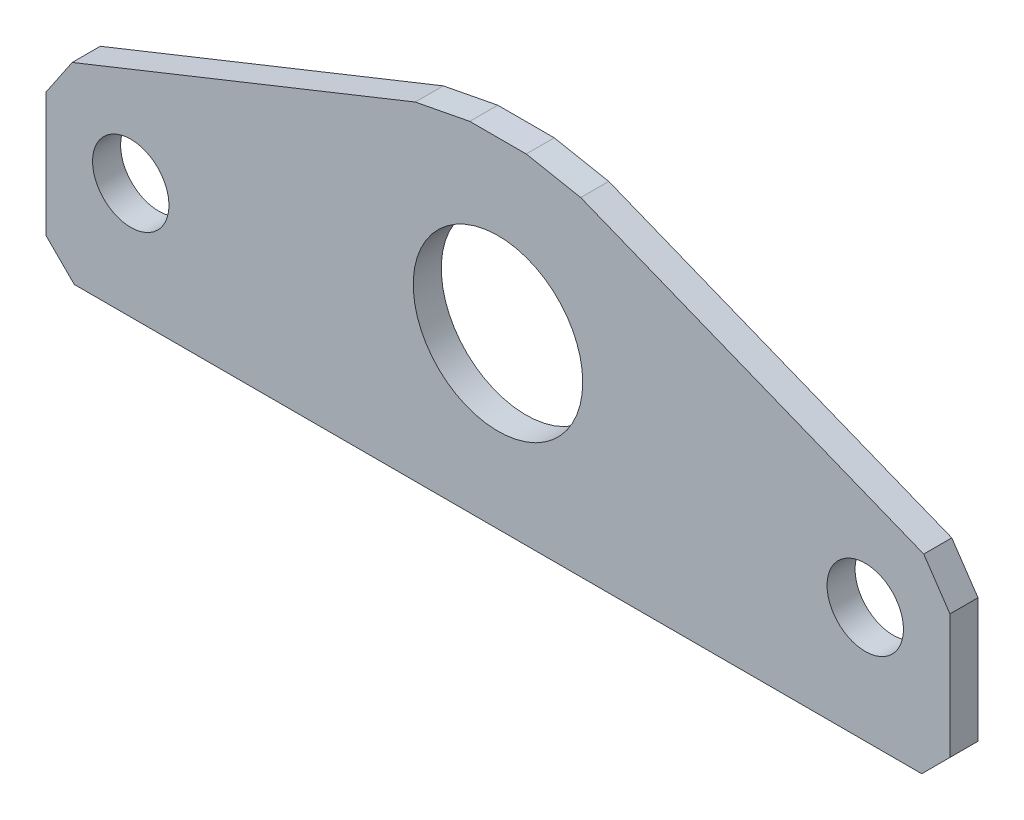
ISO-10303-21;
HEADER;
FILE_DESCRIPTION(('STEP AP214'),'2;1');
FILE_NAME('part.step','',(''),(''),'','','');
FILE_SCHEMA(('AUTOMOTIVE_DESIGN { 1 0 10303 214 1 1 1 1 }'));
ENDSEC;
DATA;
#1=APPLICATION_CONTEXT('core data for automotive mechanical design processes');
#2=APPLICATION_PROTOCOL_DEFINITION('international standard','automotive_design',2000,#1);
#3=PRODUCT_CONTEXT('',#1,'mechanical');
#4=PRODUCT('Part','Part','',(#3));
#5=PRODUCT_RELATED_PRODUCT_CATEGORY('part','',(#4));
#6=PRODUCT_DEFINITION_FORMATION('','',#4);
#7=PRODUCT_DEFINITION_CONTEXT('part definition',#1,'design');
#8=PRODUCT_DEFINITION('design','',#6,#7);
#9=PRODUCT_DEFINITION_SHAPE('','',#8);
#10=(LENGTH_UNIT() NAMED_UNIT(*) SI_UNIT(.MILLI.,.METRE.));
#11=(NAMED_UNIT(*) PLANE_ANGLE_UNIT() SI_UNIT($,.RADIAN.));
#12=(NAMED_UNIT(*) SI_UNIT($,.STERADIAN.) SOLID_ANGLE_UNIT());
#13=UNCERTAINTY_MEASURE_WITH_UNIT(LENGTH_MEASURE(1.E-05),#10,'distance_accuracy_value','');
#14=(GEOMETRIC_REPRESENTATION_CONTEXT(3) GLOBAL_UNCERTAINTY_ASSIGNED_CONTEXT((#13)) GLOBAL_UNIT_ASSIGNED_CONTEXT((#10,
#11,#12)) REPRESENTATION_CONTEXT('',''));
#15=CARTESIAN_POINT('',(0.,0.,0.));
#16=DIRECTION('',(0.,0.,1.));
#17=DIRECTION('',(1.,0.,0.));
#18=AXIS2_PLACEMENT_3D('',#15,#16,#17);
#19=CARTESIAN_POINT('',(25.4,20.955,0.));
#20=DIRECTION('',(0.,0.,-1.));
#21=DIRECTION('',(-1.,0.,0.));
#22=AXIS2_PLACEMENT_3D('',#19,#20,#21);
#23=PLANE('',#22);
#24=CARTESIAN_POINT('',(0.,0.,0.));
#25=DIRECTION('',(0.,0.,1.));
#26=DIRECTION('',(1.,0.,0.));
#27=AXIS2_PLACEMENT_3D('',#24,#25,#26);
#28=CIRCLE('',#27,4.7625);
#29=CARTESIAN_POINT('',(4.7625,0.,0.));
#30=VERTEX_POINT('',#29);
#31=EDGE_CURVE('E135',#30,#30,#28,.T.);
#32=ORIENTED_EDGE('',*,*,#31,.T.);
#33=EDGE_LOOP('',(#32));
#34=FACE_BOUND('',#33,.T.);
#35=CARTESIAN_POINT('',(-20.6375,-3.01285021,0.));
#36=DIRECTION('',(0.,0.,-1.));
#37=DIRECTION('',(-1.,0.,0.));
#38=AXIS2_PLACEMENT_3D('',#35,#36,#37);
#39=CIRCLE('',#38,2.1463);
#40=CARTESIAN_POINT('',(-22.7838,-3.01285021,0.));
#41=VERTEX_POINT('',#40);
#42=EDGE_CURVE('E137',#41,#41,#39,.F.);
#43=ORIENTED_EDGE('',*,*,#42,.T.);
#44=EDGE_LOOP('',(#43));
#45=FACE_BOUND('',#44,.T.);
#46=DIRECTION('',(0.,-1.,0.));
#47=VECTOR('',#46,1.);
#48=CARTESIAN_POINT('',(25.4,0.635000000000006,0.));
#49=LINE('',#48,#47);
#50=CARTESIAN_POINT('',(25.4,-0.952500000000007,0.));
#51=VERTEX_POINT('',#50);
#52=CARTESIAN_POINT('',(25.4,-7.9375,0.));
#53=VERTEX_POINT('',#52);
#54=EDGE_CURVE('E168',#51,#53,#49,.T.);
#55=ORIENTED_EDGE('',*,*,#54,.T.);
#56=DIRECTION('',(-0.707106781186547,-0.707106781186548,0.));
#57=VECTOR('',#56,1.);
#58=CARTESIAN_POINT('',(25.4,-7.93749999999999,0.));
#59=LINE('',#58,#57);
#60=CARTESIAN_POINT('',(23.8125,-9.525,0.));
#61=VERTEX_POINT('',#60);
#62=EDGE_CURVE('E163',#53,#61,#59,.T.);
#63=ORIENTED_EDGE('',*,*,#62,.T.);
#64=DIRECTION('',(-1.,0.,0.));
#65=VECTOR('',#64,1.);
#66=CARTESIAN_POINT('',(-25.4,-9.525,0.));
#67=LINE('',#66,#65);
#68=CARTESIAN_POINT('',(-23.8125,-9.525,0.));
#69=VERTEX_POINT('',#68);
#70=EDGE_CURVE('E158',#61,#69,#67,.T.);
#71=ORIENTED_EDGE('',*,*,#70,.T.);
#72=DIRECTION('',(-0.707106781186547,0.707106781186548,0.));
#73=VECTOR('',#72,1.);
#74=CARTESIAN_POINT('',(-23.8125,-9.525,0.));
#75=LINE('',#74,#73);
#76=CARTESIAN_POINT('',(-25.4,-7.9375,0.));
#77=VERTEX_POINT('',#76);
#78=EDGE_CURVE('E153',#69,#77,#75,.T.);
#79=ORIENTED_EDGE('',*,*,#78,.T.);
#80=DIRECTION('',(0.,1.,0.));
#81=VECTOR('',#80,1.);
#82=CARTESIAN_POINT('',(-25.4,0.635,0.));
#83=LINE('',#82,#81);
#84=CARTESIAN_POINT('',(-25.4,-0.952500000000013,0.));
#85=VERTEX_POINT('',#84);
#86=EDGE_CURVE('E148',#77,#85,#83,.T.);
#87=ORIENTED_EDGE('',*,*,#86,.T.);
#88=DIRECTION('',(0.560628809305184,0.828067230469273,0.));
#89=VECTOR('',#88,1.);
#90=CARTESIAN_POINT('',(-25.4,-0.952500000000011,0.));
#91=LINE('',#90,#89);
#92=CARTESIAN_POINT('',(-23.9260432532196,1.22458269871214,0.));
#93=VERTEX_POINT('',#92);
#94=EDGE_CURVE('E109',#85,#93,#91,.T.);
#95=ORIENTED_EDGE('',*,*,#94,.T.);
#96=DIRECTION('',(0.928476690885259,0.371390676354104,0.));
#97=VECTOR('',#96,1.);
#98=CARTESIAN_POINT('',(-25.4,0.635,0.));
#99=LINE('',#98,#97);
#100=CARTESIAN_POINT('',(-4.64895674678057,8.93541730128778,0.));
#101=VERTEX_POINT('',#100);
#102=EDGE_CURVE('E107',#93,#101,#99,.T.);
#103=ORIENTED_EDGE('',*,*,#102,.T.);
#104=DIRECTION('',(0.981956386731422,0.189107521154951,0.));
#105=VECTOR('',#104,1.);
#106=CARTESIAN_POINT('',(-4.64895674678038,8.93541730128785,0.));
#107=LINE('',#106,#105);
#108=CARTESIAN_POINT('',(-1.58749999999997,9.525,0.));
#109=VERTEX_POINT('',#108);
#110=EDGE_CURVE('E104',#101,#109,#107,.T.);
#111=ORIENTED_EDGE('',*,*,#110,.T.);
#112=DIRECTION('',(1.,0.,0.));
#113=VECTOR('',#112,1.);
#114=CARTESIAN_POINT('',(-3.175,9.525,0.));
#115=LINE('',#114,#113);
#116=CARTESIAN_POINT('',(1.58749999999982,9.52500000000001,0.));
#117=VERTEX_POINT('',#116);
#118=EDGE_CURVE('E188',#109,#117,#115,.T.);
#119=ORIENTED_EDGE('',*,*,#118,.T.);
#120=DIRECTION('',(0.981956386731422,-0.189107521154951,0.));
#121=VECTOR('',#120,1.);
#122=CARTESIAN_POINT('',(1.58749999999997,9.525,0.));
#123=LINE('',#122,#121);
#124=CARTESIAN_POINT('',(4.64895674678042,8.93541730128784,0.));
#125=VERTEX_POINT('',#124);
#126=EDGE_CURVE('E183',#117,#125,#123,.T.);
#127=ORIENTED_EDGE('',*,*,#126,.T.);
#128=DIRECTION('',(0.928476690885259,-0.371390676354104,0.));
#129=VECTOR('',#128,1.);
#130=CARTESIAN_POINT('',(25.4,0.635000000000006,0.));
#131=LINE('',#130,#129);
#132=CARTESIAN_POINT('',(23.9260432532196,1.22458269871215,0.));
#133=VERTEX_POINT('',#132);
#134=EDGE_CURVE('E178',#125,#133,#131,.T.);
#135=ORIENTED_EDGE('',*,*,#134,.T.);
#136=DIRECTION('',(0.560628809305184,-0.828067230469273,0.));
#137=VECTOR('',#136,1.);
#138=CARTESIAN_POINT('',(23.9260432532196,1.22458269871215,0.));
#139=LINE('',#138,#137);
#140=EDGE_CURVE('E173',#133,#51,#139,.T.);
#141=ORIENTED_EDGE('',*,*,#140,.T.);
#142=EDGE_LOOP('',(#55,#63,#71,#79,#87,#95,#103,#111,#119,#127,#135,#141));
#143=FACE_BOUND('',#142,.T.);
#144=CARTESIAN_POINT('',(20.6375,-3.01285020999999,0.));
#145=DIRECTION('',(0.,0.,-1.));
#146=DIRECTION('',(-1.,0.,0.));
#147=AXIS2_PLACEMENT_3D('',#144,#145,#146);
#148=CIRCLE('',#147,2.1463);
#149=CARTESIAN_POINT('',(18.4912,-3.01285020999999,0.));
#150=VERTEX_POINT('',#149);
#151=EDGE_CURVE('E20',#150,#150,#148,.F.);
#152=ORIENTED_EDGE('',*,*,#151,.T.);
#153=EDGE_LOOP('',(#152));
#154=FACE_BOUND('',#153,.T.);
#155=ADVANCED_FACE('F17',(#34,#45,#143,#154),#23,.T.);
#156=CARTESIAN_POINT('',(20.6375,-3.01285020999999,1.5748));
#157=DIRECTION('',(0.,0.,-1.));
#158=DIRECTION('',(-1.,0.,0.));
#159=AXIS2_PLACEMENT_3D('',#156,#157,#158);
#160=CYLINDRICAL_SURFACE('',#159,2.1463);
#161=CARTESIAN_POINT('',(20.6375,-3.01285020999999,1.5748));
#162=DIRECTION('',(0.,0.,-1.));
#163=DIRECTION('',(-1.,0.,0.));
#164=AXIS2_PLACEMENT_3D('',#161,#162,#163);
#165=CIRCLE('',#164,2.1463);
#166=CARTESIAN_POINT('',(18.4912,-3.01285020999999,1.5748));
#167=VERTEX_POINT('',#166);
#168=EDGE_CURVE('E132',#167,#167,#165,.F.);
#169=ORIENTED_EDGE('',*,*,#168,.T.);
#170=EDGE_LOOP('',(#169));
#171=FACE_BOUND('',#170,.T.);
#172=ORIENTED_EDGE('',*,*,#151,.F.);
#173=EDGE_LOOP('',(#172));
#174=FACE_BOUND('',#173,.T.);
#175=ADVANCED_FACE('F387',(#171,#174),#160,.F.);
#176=CARTESIAN_POINT('',(-25.4,0.635,1.5748));
#177=DIRECTION('',(0.371390676354104,-0.928476690885259,0.));
#178=DIRECTION('',(0.928476690885259,0.371390676354104,0.));
#179=AXIS2_PLACEMENT_3D('',#176,#177,#178);
#180=PLANE('',#179);
#181=DIRECTION('',(0.928476690885259,0.371390676354104,0.));
#182=VECTOR('',#181,1.);
#183=CARTESIAN_POINT('',(-23.9260432532196,1.22458269871215,1.5748));
#184=LINE('',#183,#182);
#185=CARTESIAN_POINT('',(-23.9260432532196,1.22458269871215,1.5748));
#186=VERTEX_POINT('',#185);
#187=CARTESIAN_POINT('',(-4.64895674678053,8.93541730128779,1.5748));
#188=VERTEX_POINT('',#187);
#189=EDGE_CURVE('E125',#186,#188,#184,.T.);
#190=ORIENTED_EDGE('',*,*,#189,.T.);
#191=DIRECTION('',(0.,0.,1.));
#192=VECTOR('',#191,1.);
#193=CARTESIAN_POINT('',(-4.64895674678054,8.93541730128782,1.5748));
#194=LINE('',#193,#192);
#195=EDGE_CURVE('E114',#188,#101,#194,.F.);
#196=ORIENTED_EDGE('',*,*,#195,.T.);
#197=ORIENTED_EDGE('',*,*,#102,.F.);
#198=DIRECTION('',(0.,0.,1.));
#199=VECTOR('',#198,1.);
#200=CARTESIAN_POINT('',(-23.9260432532196,1.22458269871214,1.5748));
#201=LINE('',#200,#199);
#202=EDGE_CURVE('E139',#93,#186,#201,.T.);
#203=ORIENTED_EDGE('',*,*,#202,.T.);
#204=EDGE_LOOP('',(#190,#196,#197,#203));
#205=FACE_BOUND('',#204,.T.);
#206=ADVANCED_FACE('F124',(#205),#180,.F.);
#207=CARTESIAN_POINT('',(-4.64895674678038,8.93541730128785,1.5748));
#208=DIRECTION('',(0.189107521154951,-0.981956386731422,0.));
#209=DIRECTION('',(0.981956386731422,0.189107521154951,0.));
#210=AXIS2_PLACEMENT_3D('',#207,#208,#209);
#211=PLANE('',#210);
#212=ORIENTED_EDGE('',*,*,#110,.F.);
#213=ORIENTED_EDGE('',*,*,#195,.F.);
#214=DIRECTION('',(0.98195638673142,0.189107521154962,0.));
#215=VECTOR('',#214,1.);
#216=CARTESIAN_POINT('',(-4.64895674678053,8.93541730128779,1.5748));
#217=LINE('',#216,#215);
#218=CARTESIAN_POINT('',(-1.58749999999996,9.525,1.5748));
#219=VERTEX_POINT('',#218);
#220=EDGE_CURVE('E202',#188,#219,#217,.T.);
#221=ORIENTED_EDGE('',*,*,#220,.T.);
#222=DIRECTION('',(0.,0.,-1.));
#223=VECTOR('',#222,1.);
#224=CARTESIAN_POINT('',(-1.58749999999997,9.525,1.5748));
#225=LINE('',#224,#223);
#226=EDGE_CURVE('E121',#219,#109,#225,.T.);
#227=ORIENTED_EDGE('',*,*,#226,.T.);
#228=EDGE_LOOP('',(#212,#213,#221,#227));
#229=FACE_BOUND('',#228,.T.);
#230=ADVANCED_FACE('F118',(#229),#211,.F.);
#231=CARTESIAN_POINT('',(-3.175,9.525,1.5748));
#232=DIRECTION('',(0.,-1.,0.));
#233=DIRECTION('',(0.,0.,-1.));
#234=AXIS2_PLACEMENT_3D('',#231,#232,#233);
#235=PLANE('',#234);
#236=ORIENTED_EDGE('',*,*,#118,.F.);
#237=ORIENTED_EDGE('',*,*,#226,.F.);
#238=DIRECTION('',(-1.,0.,0.));
#239=VECTOR('',#238,1.);
#240=CARTESIAN_POINT('',(25.4,9.525,1.5748));
#241=LINE('',#240,#239);
#242=CARTESIAN_POINT('',(1.58749999999981,9.52500000000001,1.5748));
#243=VERTEX_POINT('',#242);
#244=EDGE_CURVE('E199',#219,#243,#241,.F.);
#245=ORIENTED_EDGE('',*,*,#244,.T.);
#246=DIRECTION('',(0.,0.,1.));
#247=VECTOR('',#246,1.);
#248=CARTESIAN_POINT('',(1.58749999999987,9.52500000000002,1.5748));
#249=LINE('',#248,#247);
#250=EDGE_CURVE('E185',#243,#117,#249,.F.);
#251=ORIENTED_EDGE('',*,*,#250,.T.);
#252=EDGE_LOOP('',(#236,#237,#245,#251));
#253=FACE_BOUND('',#252,.T.);
#254=ADVANCED_FACE('F197',(#253),#235,.F.);
#255=CARTESIAN_POINT('',(1.58749999999997,9.525,1.5748));
#256=DIRECTION('',(-0.189107521154951,-0.981956386731422,0.));
#257=DIRECTION('',(0.981956386731422,-0.189107521154951,0.));
#258=AXIS2_PLACEMENT_3D('',#255,#256,#257);
#259=PLANE('',#258);
#260=ORIENTED_EDGE('',*,*,#126,.F.);
#261=ORIENTED_EDGE('',*,*,#250,.F.);
#262=DIRECTION('',(0.981956386731422,-0.189107521154949,0.));
#263=VECTOR('',#262,1.);
#264=CARTESIAN_POINT('',(1.58749999999986,9.525,1.5748));
#265=LINE('',#264,#263);
#266=CARTESIAN_POINT('',(4.64895674678044,8.93541730128783,1.5748));
#267=VERTEX_POINT('',#266);
#268=EDGE_CURVE('E201',#243,#267,#265,.T.);
#269=ORIENTED_EDGE('',*,*,#268,.T.);
#270=DIRECTION('',(0.,0.,1.));
#271=VECTOR('',#270,1.);
#272=CARTESIAN_POINT('',(4.64895674678047,8.93541730128782,1.5748));
#273=LINE('',#272,#271);
#274=EDGE_CURVE('E180',#267,#125,#273,.F.);
#275=ORIENTED_EDGE('',*,*,#274,.T.);
#276=EDGE_LOOP('',(#260,#261,#269,#275));
#277=FACE_BOUND('',#276,.T.);
#278=ADVANCED_FACE('F193',(#277),#259,.F.);
#279=CARTESIAN_POINT('',(25.4,0.635000000000006,1.5748));
#280=DIRECTION('',(-0.371390676354104,-0.928476690885259,0.));
#281=DIRECTION('',(0.928476690885259,-0.371390676354104,0.));
#282=AXIS2_PLACEMENT_3D('',#279,#280,#281);
#283=PLANE('',#282);
#284=ORIENTED_EDGE('',*,*,#134,.F.);
#285=ORIENTED_EDGE('',*,*,#274,.F.);
#286=DIRECTION('',(0.928476690885259,-0.371390676354104,0.));
#287=VECTOR('',#286,1.);
#288=CARTESIAN_POINT('',(4.64895674678047,8.93541730128782,1.5748));
#289=LINE('',#288,#287);
#290=CARTESIAN_POINT('',(23.9260432532196,1.22458269871215,1.5748));
#291=VERTEX_POINT('',#290);
#292=EDGE_CURVE('E204',#267,#291,#289,.T.);
#293=ORIENTED_EDGE('',*,*,#292,.T.);
#294=DIRECTION('',(0.,0.,1.));
#295=VECTOR('',#294,1.);
#296=CARTESIAN_POINT('',(23.9260432532196,1.22458269871215,1.5748));
#297=LINE('',#296,#295);
#298=EDGE_CURVE('E175',#291,#133,#297,.F.);
#299=ORIENTED_EDGE('',*,*,#298,.T.);
#300=EDGE_LOOP('',(#284,#285,#293,#299));
#301=FACE_BOUND('',#300,.T.);
#302=ADVANCED_FACE('F256',(#301),#283,.F.);
#303=CARTESIAN_POINT('',(23.9260432532196,1.22458269871215,1.5748));
#304=DIRECTION('',(-0.828067230469273,-0.560628809305184,0.));
#305=DIRECTION('',(0.560628809305184,-0.828067230469273,0.));
#306=AXIS2_PLACEMENT_3D('',#303,#304,#305);
#307=PLANE('',#306);
#308=ORIENTED_EDGE('',*,*,#140,.F.);
#309=ORIENTED_EDGE('',*,*,#298,.F.);
#310=DIRECTION('',(0.560628809305184,-0.828067230469272,0.));
#311=VECTOR('',#310,1.);
#312=CARTESIAN_POINT('',(23.9260432532196,1.22458269871215,1.5748));
#313=LINE('',#312,#311);
#314=CARTESIAN_POINT('',(25.4,-0.952500000000007,1.5748));
#315=VERTEX_POINT('',#314);
#316=EDGE_CURVE('E209',#291,#315,#313,.T.);
#317=ORIENTED_EDGE('',*,*,#316,.T.);
#318=DIRECTION('',(0.,0.,1.));
#319=VECTOR('',#318,1.);
#320=CARTESIAN_POINT('',(25.4,-0.952500000000007,1.5748));
#321=LINE('',#320,#319);
#322=EDGE_CURVE('E170',#315,#51,#321,.F.);
#323=ORIENTED_EDGE('',*,*,#322,.T.);
#324=EDGE_LOOP('',(#308,#309,#317,#323));
#325=FACE_BOUND('',#324,.T.);
#326=ADVANCED_FACE('F253',(#325),#307,.F.);
#327=CARTESIAN_POINT('',(25.4,0.635000000000006,1.5748));
#328=DIRECTION('',(-1.,0.,0.));
#329=DIRECTION('',(0.,-1.,0.));
#330=AXIS2_PLACEMENT_3D('',#327,#328,#329);
#331=PLANE('',#330);
#332=ORIENTED_EDGE('',*,*,#54,.F.);
#333=ORIENTED_EDGE('',*,*,#322,.F.);
#334=DIRECTION('',(0.,1.,0.));
#335=VECTOR('',#334,1.);
#336=CARTESIAN_POINT('',(25.4,20.955,1.5748));
#337=LINE('',#336,#335);
#338=CARTESIAN_POINT('',(25.4,-7.9375,1.5748));
#339=VERTEX_POINT('',#338);
#340=EDGE_CURVE('E212',#315,#339,#337,.F.);
#341=ORIENTED_EDGE('',*,*,#340,.T.);
#342=DIRECTION('',(0.,0.,1.));
#343=VECTOR('',#342,1.);
#344=CARTESIAN_POINT('',(25.4,-7.93749999999999,1.5748));
#345=LINE('',#344,#343);
#346=EDGE_CURVE('E165',#339,#53,#345,.F.);
#347=ORIENTED_EDGE('',*,*,#346,.T.);
#348=EDGE_LOOP('',(#332,#333,#341,#347));
#349=FACE_BOUND('',#348,.T.);
#350=ADVANCED_FACE('F250',(#349),#331,.F.);
#351=CARTESIAN_POINT('',(25.4,-7.93749999999999,1.5748));
#352=DIRECTION('',(-0.707106781186548,0.707106781186547,0.));
#353=DIRECTION('',(-0.707106781186547,-0.707106781186548,0.));
#354=AXIS2_PLACEMENT_3D('',#351,#352,#353);
#355=PLANE('',#354);
#356=ORIENTED_EDGE('',*,*,#62,.F.);
#357=ORIENTED_EDGE('',*,*,#346,.F.);
#358=DIRECTION('',(-0.707106781186547,-0.707106781186547,0.));
#359=VECTOR('',#358,1.);
#360=CARTESIAN_POINT('',(25.4,-7.93749999999999,1.5748));
#361=LINE('',#360,#359);
#362=CARTESIAN_POINT('',(23.8125,-9.525,1.5748));
#363=VERTEX_POINT('',#362);
#364=EDGE_CURVE('E215',#339,#363,#361,.T.);
#365=ORIENTED_EDGE('',*,*,#364,.T.);
#366=DIRECTION('',(0.,0.,1.));
#367=VECTOR('',#366,1.);
#368=CARTESIAN_POINT('',(23.8125,-9.52499999999999,1.5748));
#369=LINE('',#368,#367);
#370=EDGE_CURVE('E160',#363,#61,#369,.F.);
#371=ORIENTED_EDGE('',*,*,#370,.T.);
#372=EDGE_LOOP('',(#356,#357,#365,#371));
#373=FACE_BOUND('',#372,.T.);
#374=ADVANCED_FACE('F245',(#373),#355,.F.);
#375=CARTESIAN_POINT('',(-25.4,-9.525,1.5748));
#376=DIRECTION('',(0.,1.,0.));
#377=DIRECTION('',(-1.,0.,0.));
#378=AXIS2_PLACEMENT_3D('',#375,#376,#377);
#379=PLANE('',#378);
#380=ORIENTED_EDGE('',*,*,#70,.F.);
#381=ORIENTED_EDGE('',*,*,#370,.F.);
#382=DIRECTION('',(-1.,0.,0.));
#383=VECTOR('',#382,1.);
#384=CARTESIAN_POINT('',(25.4,-9.525,1.5748));
#385=LINE('',#384,#383);
#386=CARTESIAN_POINT('',(-23.8125,-9.525,1.5748));
#387=VERTEX_POINT('',#386);
#388=EDGE_CURVE('E218',#363,#387,#385,.T.);
#389=ORIENTED_EDGE('',*,*,#388,.T.);
#390=DIRECTION('',(0.,0.,1.));
#391=VECTOR('',#390,1.);
#392=CARTESIAN_POINT('',(-23.8125,-9.52499999999999,1.5748));
#393=LINE('',#392,#391);
#394=EDGE_CURVE('E155',#387,#69,#393,.F.);
#395=ORIENTED_EDGE('',*,*,#394,.T.);
#396=EDGE_LOOP('',(#380,#381,#389,#395));
#397=FACE_BOUND('',#396,.T.);
#398=ADVANCED_FACE('F242',(#397),#379,.F.);
#399=CARTESIAN_POINT('',(-23.8125,-9.525,1.5748));
#400=DIRECTION('',(0.707106781186548,0.707106781186547,0.));
#401=DIRECTION('',(-0.707106781186547,0.707106781186548,0.));
#402=AXIS2_PLACEMENT_3D('',#399,#400,#401);
#403=PLANE('',#402);
#404=ORIENTED_EDGE('',*,*,#78,.F.);
#405=ORIENTED_EDGE('',*,*,#394,.F.);
#406=DIRECTION('',(-0.707106781186544,0.707106781186551,0.));
#407=VECTOR('',#406,1.);
#408=CARTESIAN_POINT('',(-23.8125,-9.525,1.5748));
#409=LINE('',#408,#407);
#410=CARTESIAN_POINT('',(-25.4,-7.9375,1.5748));
#411=VERTEX_POINT('',#410);
#412=EDGE_CURVE('E221',#387,#411,#409,.T.);
#413=ORIENTED_EDGE('',*,*,#412,.T.);
#414=DIRECTION('',(0.,0.,-1.));
#415=VECTOR('',#414,1.);
#416=CARTESIAN_POINT('',(-25.4,-7.9375,1.5748));
#417=LINE('',#416,#415);
#418=EDGE_CURVE('E150',#411,#77,#417,.T.);
#419=ORIENTED_EDGE('',*,*,#418,.T.);
#420=EDGE_LOOP('',(#404,#405,#413,#419));
#421=FACE_BOUND('',#420,.T.);
#422=ADVANCED_FACE('F237',(#421),#403,.F.);
#423=CARTESIAN_POINT('',(-25.4,0.635,1.5748));
#424=DIRECTION('',(1.,0.,0.));
#425=DIRECTION('',(0.,0.,-1.));
#426=AXIS2_PLACEMENT_3D('',#423,#424,#425);
#427=PLANE('',#426);
#428=ORIENTED_EDGE('',*,*,#86,.F.);
#429=ORIENTED_EDGE('',*,*,#418,.F.);
#430=DIRECTION('',(0.,1.,0.));
#431=VECTOR('',#430,1.);
#432=CARTESIAN_POINT('',(-25.4,20.955,1.5748));
#433=LINE('',#432,#431);
#434=CARTESIAN_POINT('',(-25.4,-0.952500000000014,1.5748));
#435=VERTEX_POINT('',#434);
#436=EDGE_CURVE('E224',#411,#435,#433,.T.);
#437=ORIENTED_EDGE('',*,*,#436,.T.);
#438=DIRECTION('',(0.,0.,1.));
#439=VECTOR('',#438,1.);
#440=CARTESIAN_POINT('',(-25.4,-0.952500000000012,1.5748));
#441=LINE('',#440,#439);
#442=EDGE_CURVE('E35',#435,#85,#441,.F.);
#443=ORIENTED_EDGE('',*,*,#442,.T.);
#444=EDGE_LOOP('',(#428,#429,#437,#443));
#445=FACE_BOUND('',#444,.T.);
#446=ADVANCED_FACE('F234',(#445),#427,.F.);
#447=CARTESIAN_POINT('',(-25.4,-0.952500000000011,1.5748));
#448=DIRECTION('',(0.828067230469273,-0.560628809305184,0.));
#449=DIRECTION('',(0.560628809305184,0.828067230469273,0.));
#450=AXIS2_PLACEMENT_3D('',#447,#448,#449);
#451=PLANE('',#450);
#452=ORIENTED_EDGE('',*,*,#94,.F.);
#453=ORIENTED_EDGE('',*,*,#442,.F.);
#454=DIRECTION('',(0.560628809305185,0.828067230469272,0.));
#455=VECTOR('',#454,1.);
#456=CARTESIAN_POINT('',(-25.4,-0.952500000000012,1.5748));
#457=LINE('',#456,#455);
#458=EDGE_CURVE('E131',#435,#186,#457,.T.);
#459=ORIENTED_EDGE('',*,*,#458,.T.);
#460=ORIENTED_EDGE('',*,*,#202,.F.);
#461=EDGE_LOOP('',(#452,#453,#459,#460));
#462=FACE_BOUND('',#461,.T.);
#463=ADVANCED_FACE('F227',(#462),#451,.F.);
#464=CARTESIAN_POINT('',(-20.6375,-3.01285021,1.5748));
#465=DIRECTION('',(0.,0.,-1.));
#466=DIRECTION('',(-1.,0.,0.));
#467=AXIS2_PLACEMENT_3D('',#464,#465,#466);
#468=CYLINDRICAL_SURFACE('',#467,2.1463);
#469=CARTESIAN_POINT('',(-20.6375,-3.01285021,1.5748));
#470=DIRECTION('',(0.,0.,-1.));
#471=DIRECTION('',(-1.,0.,0.));
#472=AXIS2_PLACEMENT_3D('',#469,#470,#471);
#473=CIRCLE('',#472,2.1463);
#474=CARTESIAN_POINT('',(-22.7838,-3.01285021,1.5748));
#475=VERTEX_POINT('',#474);
#476=EDGE_CURVE('E26',#475,#475,#473,.F.);
#477=ORIENTED_EDGE('',*,*,#476,.T.);
#478=EDGE_LOOP('',(#477));
#479=FACE_BOUND('',#478,.T.);
#480=ORIENTED_EDGE('',*,*,#42,.F.);
#481=EDGE_LOOP('',(#480));
#482=FACE_BOUND('',#481,.T.);
#483=ADVANCED_FACE('F273',(#479,#482),#468,.F.);
#484=CARTESIAN_POINT('',(0.,0.,0.));
#485=DIRECTION('',(0.,0.,1.));
#486=DIRECTION('',(1.,0.,0.));
#487=AXIS2_PLACEMENT_3D('',#484,#485,#486);
#488=CYLINDRICAL_SURFACE('',#487,4.7625);
#489=ORIENTED_EDGE('',*,*,#31,.F.);
#490=EDGE_LOOP('',(#489));
#491=FACE_BOUND('',#490,.T.);
#492=CARTESIAN_POINT('',(0.,0.,1.5748));
#493=DIRECTION('',(0.,0.,1.));
#494=DIRECTION('',(1.,0.,0.));
#495=AXIS2_PLACEMENT_3D('',#492,#493,#494);
#496=CIRCLE('',#495,4.7625);
#497=CARTESIAN_POINT('',(4.7625,0.,1.5748));
#498=VERTEX_POINT('',#497);
#499=EDGE_CURVE('E11',#498,#498,#496,.T.);
#500=ORIENTED_EDGE('',*,*,#499,.T.);
#501=EDGE_LOOP('',(#500));
#502=FACE_BOUND('',#501,.T.);
#503=ADVANCED_FACE('F267',(#491,#502),#488,.F.);
#504=CARTESIAN_POINT('',(25.4,20.955,1.5748));
#505=DIRECTION('',(0.,0.,-1.));
#506=DIRECTION('',(-1.,0.,0.));
#507=AXIS2_PLACEMENT_3D('',#504,#505,#506);
#508=PLANE('',#507);
#509=ORIENTED_EDGE('',*,*,#499,.F.);
#510=EDGE_LOOP('',(#509));
#511=FACE_BOUND('',#510,.T.);
#512=ORIENTED_EDGE('',*,*,#476,.F.);
#513=EDGE_LOOP('',(#512));
#514=FACE_BOUND('',#513,.T.);
#515=ORIENTED_EDGE('',*,*,#436,.F.);
#516=ORIENTED_EDGE('',*,*,#412,.F.);
#517=ORIENTED_EDGE('',*,*,#388,.F.);
#518=ORIENTED_EDGE('',*,*,#364,.F.);
#519=ORIENTED_EDGE('',*,*,#340,.F.);
#520=ORIENTED_EDGE('',*,*,#316,.F.);
#521=ORIENTED_EDGE('',*,*,#292,.F.);
#522=ORIENTED_EDGE('',*,*,#268,.F.);
#523=ORIENTED_EDGE('',*,*,#244,.F.);
#524=ORIENTED_EDGE('',*,*,#220,.F.);
#525=ORIENTED_EDGE('',*,*,#189,.F.);
#526=ORIENTED_EDGE('',*,*,#458,.F.);
#527=EDGE_LOOP('',(#515,#516,#517,#518,#519,#520,#521,#522,#523,#524,#525,#526));
#528=FACE_BOUND('',#527,.T.);
#529=ORIENTED_EDGE('',*,*,#168,.F.);
#530=EDGE_LOOP('',(#529));
#531=FACE_BOUND('',#530,.T.);
#532=ADVANCED_FACE('F229',(#511,#514,#528,#531),#508,.F.);
#533=CLOSED_SHELL('',(#155,#175,#206,#230,#254,#278,#302,#326,#350,#374,#398,#422,#446,#463,
#483,#503,#532));
#534=MANIFOLD_SOLID_BREP('B1',#533);
#535=ADVANCED_BREP_SHAPE_REPRESENTATION('',(#18,#534),#14);
#536=SHAPE_DEFINITION_REPRESENTATION(#9,#535);
ENDSEC;
END-ISO-10303-21;
